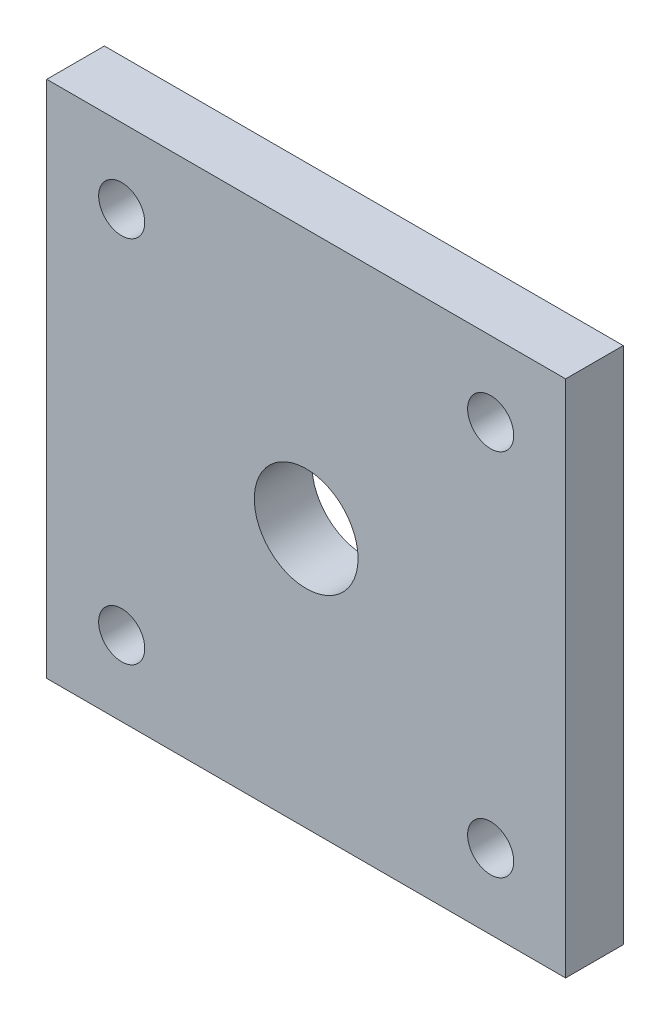
ISO-10303-21;
HEADER;
FILE_DESCRIPTION(('STEP AP214'),'2;1');
FILE_NAME('part.step','',(''),(''),'','','');
FILE_SCHEMA(('AUTOMOTIVE_DESIGN { 1 0 10303 214 1 1 1 1 }'));
ENDSEC;
DATA;
#1=APPLICATION_CONTEXT('core data for automotive mechanical design processes');
#2=APPLICATION_PROTOCOL_DEFINITION('international standard','automotive_design',2000,#1);
#3=PRODUCT_CONTEXT('',#1,'mechanical');
#4=PRODUCT('Part','Part','',(#3));
#5=PRODUCT_RELATED_PRODUCT_CATEGORY('part','',(#4));
#6=PRODUCT_DEFINITION_FORMATION('','',#4);
#7=PRODUCT_DEFINITION_CONTEXT('part definition',#1,'design');
#8=PRODUCT_DEFINITION('design','',#6,#7);
#9=PRODUCT_DEFINITION_SHAPE('','',#8);
#10=(LENGTH_UNIT() NAMED_UNIT(*) SI_UNIT(.MILLI.,.METRE.));
#11=(NAMED_UNIT(*) PLANE_ANGLE_UNIT() SI_UNIT($,.RADIAN.));
#12=(NAMED_UNIT(*) SI_UNIT($,.STERADIAN.) SOLID_ANGLE_UNIT());
#13=UNCERTAINTY_MEASURE_WITH_UNIT(LENGTH_MEASURE(1.E-05),#10,'distance_accuracy_value','');
#14=(GEOMETRIC_REPRESENTATION_CONTEXT(3) GLOBAL_UNCERTAINTY_ASSIGNED_CONTEXT((#13)) GLOBAL_UNIT_ASSIGNED_CONTEXT((#10,
#11,#12)) REPRESENTATION_CONTEXT('',''));
#15=CARTESIAN_POINT('',(0.,0.,0.));
#16=DIRECTION('',(0.,0.,1.));
#17=DIRECTION('',(1.,0.,0.));
#18=AXIS2_PLACEMENT_3D('',#15,#16,#17);
#19=CARTESIAN_POINT('',(0.,0.,5.));
#20=DIRECTION('',(0.,0.,-1.));
#21=DIRECTION('',(-1.,0.,0.));
#22=AXIS2_PLACEMENT_3D('',#19,#20,#21);
#23=PLANE('',#22);
#24=CARTESIAN_POINT('',(16.,16.,5.));
#25=DIRECTION('',(0.,0.,-1.));
#26=DIRECTION('',(-1.,0.,0.));
#27=AXIS2_PLACEMENT_3D('',#24,#25,#26);
#28=CIRCLE('',#27,2.);
#29=CARTESIAN_POINT('',(14.,16.,5.));
#30=VERTEX_POINT('',#29);
#31=EDGE_CURVE('E128',#30,#30,#28,.T.);
#32=ORIENTED_EDGE('',*,*,#31,.T.);
#33=EDGE_LOOP('',(#32));
#34=FACE_BOUND('',#33,.T.);
#35=CARTESIAN_POINT('',(-16.,16.,5.));
#36=DIRECTION('',(0.,0.,-1.));
#37=DIRECTION('',(-1.,0.,0.));
#38=AXIS2_PLACEMENT_3D('',#35,#36,#37);
#39=CIRCLE('',#38,2.);
#40=CARTESIAN_POINT('',(-18.,16.,5.));
#41=VERTEX_POINT('',#40);
#42=EDGE_CURVE('E134',#41,#41,#39,.T.);
#43=ORIENTED_EDGE('',*,*,#42,.T.);
#44=EDGE_LOOP('',(#43));
#45=FACE_BOUND('',#44,.T.);
#46=CARTESIAN_POINT('',(-16.,-16.,5.));
#47=DIRECTION('',(0.,0.,-1.));
#48=DIRECTION('',(-1.,0.,0.));
#49=AXIS2_PLACEMENT_3D('',#46,#47,#48);
#50=CIRCLE('',#49,2.);
#51=CARTESIAN_POINT('',(-18.,-16.,5.));
#52=VERTEX_POINT('',#51);
#53=EDGE_CURVE('E140',#52,#52,#50,.T.);
#54=ORIENTED_EDGE('',*,*,#53,.T.);
#55=EDGE_LOOP('',(#54));
#56=FACE_BOUND('',#55,.T.);
#57=CARTESIAN_POINT('',(16.,-16.,5.));
#58=DIRECTION('',(0.,0.,-1.));
#59=DIRECTION('',(-1.,0.,0.));
#60=AXIS2_PLACEMENT_3D('',#57,#58,#59);
#61=CIRCLE('',#60,2.);
#62=CARTESIAN_POINT('',(14.,-16.,5.));
#63=VERTEX_POINT('',#62);
#64=EDGE_CURVE('E119',#63,#63,#61,.T.);
#65=ORIENTED_EDGE('',*,*,#64,.T.);
#66=EDGE_LOOP('',(#65));
#67=FACE_BOUND('',#66,.T.);
#68=DIRECTION('',(0.,1.,0.));
#69=VECTOR('',#68,1.);
#70=CARTESIAN_POINT('',(22.5,-22.5,5.));
#71=LINE('',#70,#69);
#72=CARTESIAN_POINT('',(22.5,-22.5,5.));
#73=VERTEX_POINT('',#72);
#74=CARTESIAN_POINT('',(22.5,22.5,5.));
#75=VERTEX_POINT('',#74);
#76=EDGE_CURVE('E89',#73,#75,#71,.T.);
#77=ORIENTED_EDGE('',*,*,#76,.T.);
#78=DIRECTION('',(-1.,0.,0.));
#79=VECTOR('',#78,1.);
#80=CARTESIAN_POINT('',(-22.5,22.5,5.));
#81=LINE('',#80,#79);
#82=CARTESIAN_POINT('',(-22.5,22.5,5.));
#83=VERTEX_POINT('',#82);
#84=EDGE_CURVE('E84',#75,#83,#81,.T.);
#85=ORIENTED_EDGE('',*,*,#84,.T.);
#86=DIRECTION('',(0.,-1.,0.));
#87=VECTOR('',#86,1.);
#88=CARTESIAN_POINT('',(-22.5,-22.5,5.));
#89=LINE('',#88,#87);
#90=CARTESIAN_POINT('',(-22.5,-22.5,5.));
#91=VERTEX_POINT('',#90);
#92=EDGE_CURVE('E87',#83,#91,#89,.T.);
#93=ORIENTED_EDGE('',*,*,#92,.T.);
#94=DIRECTION('',(1.,0.,0.));
#95=VECTOR('',#94,1.);
#96=CARTESIAN_POINT('',(-22.5,-22.5,5.));
#97=LINE('',#96,#95);
#98=EDGE_CURVE('E54',#91,#73,#97,.T.);
#99=ORIENTED_EDGE('',*,*,#98,.T.);
#100=EDGE_LOOP('',(#77,#85,#93,#99));
#101=FACE_BOUND('',#100,.T.);
#102=CARTESIAN_POINT('',(0.,0.,5.));
#103=DIRECTION('',(0.,0.,1.));
#104=DIRECTION('',(1.,0.,0.));
#105=AXIS2_PLACEMENT_3D('',#102,#103,#104);
#106=CIRCLE('',#105,4.5);
#107=CARTESIAN_POINT('',(4.5,0.,5.));
#108=VERTEX_POINT('',#107);
#109=EDGE_CURVE('E104',#108,#108,#106,.T.);
#110=ORIENTED_EDGE('',*,*,#109,.F.);
#111=EDGE_LOOP('',(#110));
#112=FACE_BOUND('',#111,.T.);
#113=ADVANCED_FACE('F37',(#34,#45,#56,#67,#101,#112),#23,.F.);
#114=CARTESIAN_POINT('',(0.,0.,0.));
#115=DIRECTION('',(0.,0.,-1.));
#116=DIRECTION('',(-1.,0.,0.));
#117=AXIS2_PLACEMENT_3D('',#114,#115,#116);
#118=PLANE('',#117);
#119=CARTESIAN_POINT('',(16.,16.,0.));
#120=DIRECTION('',(0.,0.,-1.));
#121=DIRECTION('',(-1.,0.,0.));
#122=AXIS2_PLACEMENT_3D('',#119,#120,#121);
#123=CIRCLE('',#122,2.);
#124=CARTESIAN_POINT('',(14.,16.,0.));
#125=VERTEX_POINT('',#124);
#126=EDGE_CURVE('E131',#125,#125,#123,.T.);
#127=ORIENTED_EDGE('',*,*,#126,.F.);
#128=EDGE_LOOP('',(#127));
#129=FACE_BOUND('',#128,.T.);
#130=CARTESIAN_POINT('',(-16.,16.,0.));
#131=DIRECTION('',(0.,0.,-1.));
#132=DIRECTION('',(-1.,0.,0.));
#133=AXIS2_PLACEMENT_3D('',#130,#131,#132);
#134=CIRCLE('',#133,2.);
#135=CARTESIAN_POINT('',(-18.,16.,0.));
#136=VERTEX_POINT('',#135);
#137=EDGE_CURVE('E137',#136,#136,#134,.T.);
#138=ORIENTED_EDGE('',*,*,#137,.F.);
#139=EDGE_LOOP('',(#138));
#140=FACE_BOUND('',#139,.T.);
#141=CARTESIAN_POINT('',(-16.,-16.,0.));
#142=DIRECTION('',(0.,0.,-1.));
#143=DIRECTION('',(-1.,0.,0.));
#144=AXIS2_PLACEMENT_3D('',#141,#142,#143);
#145=CIRCLE('',#144,2.);
#146=CARTESIAN_POINT('',(-18.,-16.,0.));
#147=VERTEX_POINT('',#146);
#148=EDGE_CURVE('E125',#147,#147,#145,.T.);
#149=ORIENTED_EDGE('',*,*,#148,.F.);
#150=EDGE_LOOP('',(#149));
#151=FACE_BOUND('',#150,.T.);
#152=CARTESIAN_POINT('',(16.,-16.,0.));
#153=DIRECTION('',(0.,0.,-1.));
#154=DIRECTION('',(-1.,0.,0.));
#155=AXIS2_PLACEMENT_3D('',#152,#153,#154);
#156=CIRCLE('',#155,2.);
#157=CARTESIAN_POINT('',(14.,-16.,0.));
#158=VERTEX_POINT('',#157);
#159=EDGE_CURVE('E122',#158,#158,#156,.T.);
#160=ORIENTED_EDGE('',*,*,#159,.F.);
#161=EDGE_LOOP('',(#160));
#162=FACE_BOUND('',#161,.T.);
#163=DIRECTION('',(0.,1.,0.));
#164=VECTOR('',#163,1.);
#165=CARTESIAN_POINT('',(22.5,-22.5,0.));
#166=LINE('',#165,#164);
#167=CARTESIAN_POINT('',(22.5,-22.5,0.));
#168=VERTEX_POINT('',#167);
#169=CARTESIAN_POINT('',(22.5,22.5,0.));
#170=VERTEX_POINT('',#169);
#171=EDGE_CURVE('E101',#168,#170,#166,.T.);
#172=ORIENTED_EDGE('',*,*,#171,.F.);
#173=DIRECTION('',(1.,0.,0.));
#174=VECTOR('',#173,1.);
#175=CARTESIAN_POINT('',(-22.5,-22.5,0.));
#176=LINE('',#175,#174);
#177=CARTESIAN_POINT('',(-22.5,-22.5,0.));
#178=VERTEX_POINT('',#177);
#179=EDGE_CURVE('E77',#178,#168,#176,.T.);
#180=ORIENTED_EDGE('',*,*,#179,.F.);
#181=DIRECTION('',(0.,-1.,0.));
#182=VECTOR('',#181,1.);
#183=CARTESIAN_POINT('',(-22.5,-22.5,0.));
#184=LINE('',#183,#182);
#185=CARTESIAN_POINT('',(-22.5,22.5,0.));
#186=VERTEX_POINT('',#185);
#187=EDGE_CURVE('E71',#186,#178,#184,.T.);
#188=ORIENTED_EDGE('',*,*,#187,.F.);
#189=DIRECTION('',(-1.,0.,0.));
#190=VECTOR('',#189,1.);
#191=CARTESIAN_POINT('',(-22.5,22.5,0.));
#192=LINE('',#191,#190);
#193=EDGE_CURVE('E93',#170,#186,#192,.T.);
#194=ORIENTED_EDGE('',*,*,#193,.F.);
#195=EDGE_LOOP('',(#172,#180,#188,#194));
#196=FACE_BOUND('',#195,.T.);
#197=CARTESIAN_POINT('',(0.,0.,0.));
#198=DIRECTION('',(0.,0.,1.));
#199=DIRECTION('',(1.,0.,0.));
#200=AXIS2_PLACEMENT_3D('',#197,#198,#199);
#201=CIRCLE('',#200,4.5);
#202=CARTESIAN_POINT('',(4.5,0.,0.));
#203=VERTEX_POINT('',#202);
#204=EDGE_CURVE('E116',#203,#203,#201,.T.);
#205=ORIENTED_EDGE('',*,*,#204,.T.);
#206=EDGE_LOOP('',(#205));
#207=FACE_BOUND('',#206,.T.);
#208=ADVANCED_FACE('F112',(#129,#140,#151,#162,#196,#207),#118,.T.);
#209=CARTESIAN_POINT('',(22.5,-22.5,5.));
#210=DIRECTION('',(-1.,0.,0.));
#211=DIRECTION('',(0.,0.,1.));
#212=AXIS2_PLACEMENT_3D('',#209,#210,#211);
#213=PLANE('',#212);
#214=ORIENTED_EDGE('',*,*,#171,.T.);
#215=DIRECTION('',(0.,0.,-1.));
#216=VECTOR('',#215,1.);
#217=CARTESIAN_POINT('',(22.5,22.5,5.));
#218=LINE('',#217,#216);
#219=EDGE_CURVE('E11',#75,#170,#218,.T.);
#220=ORIENTED_EDGE('',*,*,#219,.F.);
#221=ORIENTED_EDGE('',*,*,#76,.F.);
#222=DIRECTION('',(0.,0.,-1.));
#223=VECTOR('',#222,1.);
#224=CARTESIAN_POINT('',(22.5,-22.5,5.));
#225=LINE('',#224,#223);
#226=EDGE_CURVE('E97',#73,#168,#225,.T.);
#227=ORIENTED_EDGE('',*,*,#226,.T.);
#228=EDGE_LOOP('',(#214,#220,#221,#227));
#229=FACE_BOUND('',#228,.T.);
#230=ADVANCED_FACE('F39',(#229),#213,.F.);
#231=CARTESIAN_POINT('',(-22.5,22.5,5.));
#232=DIRECTION('',(0.,-1.,0.));
#233=DIRECTION('',(0.,0.,-1.));
#234=AXIS2_PLACEMENT_3D('',#231,#232,#233);
#235=PLANE('',#234);
#236=ORIENTED_EDGE('',*,*,#193,.T.);
#237=DIRECTION('',(0.,0.,-1.));
#238=VECTOR('',#237,1.);
#239=CARTESIAN_POINT('',(-22.5,22.5,5.));
#240=LINE('',#239,#238);
#241=EDGE_CURVE('E46',#83,#186,#240,.T.);
#242=ORIENTED_EDGE('',*,*,#241,.F.);
#243=ORIENTED_EDGE('',*,*,#84,.F.);
#244=ORIENTED_EDGE('',*,*,#219,.T.);
#245=EDGE_LOOP('',(#236,#242,#243,#244));
#246=FACE_BOUND('',#245,.T.);
#247=ADVANCED_FACE('F92',(#246),#235,.F.);
#248=CARTESIAN_POINT('',(-22.5,-22.5,5.));
#249=DIRECTION('',(1.,0.,0.));
#250=DIRECTION('',(0.,0.,-1.));
#251=AXIS2_PLACEMENT_3D('',#248,#249,#250);
#252=PLANE('',#251);
#253=ORIENTED_EDGE('',*,*,#187,.T.);
#254=DIRECTION('',(0.,0.,-1.));
#255=VECTOR('',#254,1.);
#256=CARTESIAN_POINT('',(-22.5,-22.5,5.));
#257=LINE('',#256,#255);
#258=EDGE_CURVE('E94',#91,#178,#257,.T.);
#259=ORIENTED_EDGE('',*,*,#258,.F.);
#260=ORIENTED_EDGE('',*,*,#92,.F.);
#261=ORIENTED_EDGE('',*,*,#241,.T.);
#262=EDGE_LOOP('',(#253,#259,#260,#261));
#263=FACE_BOUND('',#262,.T.);
#264=ADVANCED_FACE('F95',(#263),#252,.F.);
#265=CARTESIAN_POINT('',(-22.5,-22.5,5.));
#266=DIRECTION('',(0.,1.,0.));
#267=DIRECTION('',(0.,0.,1.));
#268=AXIS2_PLACEMENT_3D('',#265,#266,#267);
#269=PLANE('',#268);
#270=ORIENTED_EDGE('',*,*,#179,.T.);
#271=ORIENTED_EDGE('',*,*,#226,.F.);
#272=ORIENTED_EDGE('',*,*,#98,.F.);
#273=ORIENTED_EDGE('',*,*,#258,.T.);
#274=EDGE_LOOP('',(#270,#271,#272,#273));
#275=FACE_BOUND('',#274,.T.);
#276=ADVANCED_FACE('F109',(#275),#269,.F.);
#277=CARTESIAN_POINT('',(0.,0.,5.));
#278=DIRECTION('',(0.,0.,-1.));
#279=DIRECTION('',(-1.,0.,0.));
#280=AXIS2_PLACEMENT_3D('',#277,#278,#279);
#281=CYLINDRICAL_SURFACE('',#280,4.5);
#282=ORIENTED_EDGE('',*,*,#109,.T.);
#283=EDGE_LOOP('',(#282));
#284=FACE_BOUND('',#283,.T.);
#285=ORIENTED_EDGE('',*,*,#204,.F.);
#286=EDGE_LOOP('',(#285));
#287=FACE_BOUND('',#286,.T.);
#288=ADVANCED_FACE('F158',(#284,#287),#281,.F.);
#289=CARTESIAN_POINT('',(16.,-16.,5.));
#290=DIRECTION('',(0.,0.,-1.));
#291=DIRECTION('',(-1.,0.,0.));
#292=AXIS2_PLACEMENT_3D('',#289,#290,#291);
#293=CYLINDRICAL_SURFACE('',#292,2.);
#294=ORIENTED_EDGE('',*,*,#159,.T.);
#295=EDGE_LOOP('',(#294));
#296=FACE_BOUND('',#295,.T.);
#297=ORIENTED_EDGE('',*,*,#64,.F.);
#298=EDGE_LOOP('',(#297));
#299=FACE_BOUND('',#298,.T.);
#300=ADVANCED_FACE('F155',(#296,#299),#293,.F.);
#301=CARTESIAN_POINT('',(-16.,-16.,5.));
#302=DIRECTION('',(0.,0.,-1.));
#303=DIRECTION('',(-1.,0.,0.));
#304=AXIS2_PLACEMENT_3D('',#301,#302,#303);
#305=CYLINDRICAL_SURFACE('',#304,2.);
#306=ORIENTED_EDGE('',*,*,#148,.T.);
#307=EDGE_LOOP('',(#306));
#308=FACE_BOUND('',#307,.T.);
#309=ORIENTED_EDGE('',*,*,#53,.F.);
#310=EDGE_LOOP('',(#309));
#311=FACE_BOUND('',#310,.T.);
#312=ADVANCED_FACE('F146',(#308,#311),#305,.F.);
#313=CARTESIAN_POINT('',(-16.,16.,5.));
#314=DIRECTION('',(0.,0.,-1.));
#315=DIRECTION('',(-1.,0.,0.));
#316=AXIS2_PLACEMENT_3D('',#313,#314,#315);
#317=CYLINDRICAL_SURFACE('',#316,2.);
#318=ORIENTED_EDGE('',*,*,#137,.T.);
#319=EDGE_LOOP('',(#318));
#320=FACE_BOUND('',#319,.T.);
#321=ORIENTED_EDGE('',*,*,#42,.F.);
#322=EDGE_LOOP('',(#321));
#323=FACE_BOUND('',#322,.T.);
#324=ADVANCED_FACE('F236',(#320,#323),#317,.F.);
#325=CARTESIAN_POINT('',(16.,16.,5.));
#326=DIRECTION('',(0.,0.,-1.));
#327=DIRECTION('',(-1.,0.,0.));
#328=AXIS2_PLACEMENT_3D('',#325,#326,#327);
#329=CYLINDRICAL_SURFACE('',#328,2.);
#330=ORIENTED_EDGE('',*,*,#126,.T.);
#331=EDGE_LOOP('',(#330));
#332=FACE_BOUND('',#331,.T.);
#333=ORIENTED_EDGE('',*,*,#31,.F.);
#334=EDGE_LOOP('',(#333));
#335=FACE_BOUND('',#334,.T.);
#336=ADVANCED_FACE('F245',(#332,#335),#329,.F.);
#337=CLOSED_SHELL('',(#113,#208,#230,#247,#264,#276,#288,#300,#312,#324,#336));
#338=MANIFOLD_SOLID_BREP('B2',#337);
#339=ADVANCED_BREP_SHAPE_REPRESENTATION('',(#18,#338),#14);
#340=SHAPE_DEFINITION_REPRESENTATION(#9,#339);
ENDSEC;
END-ISO-10303-21;
